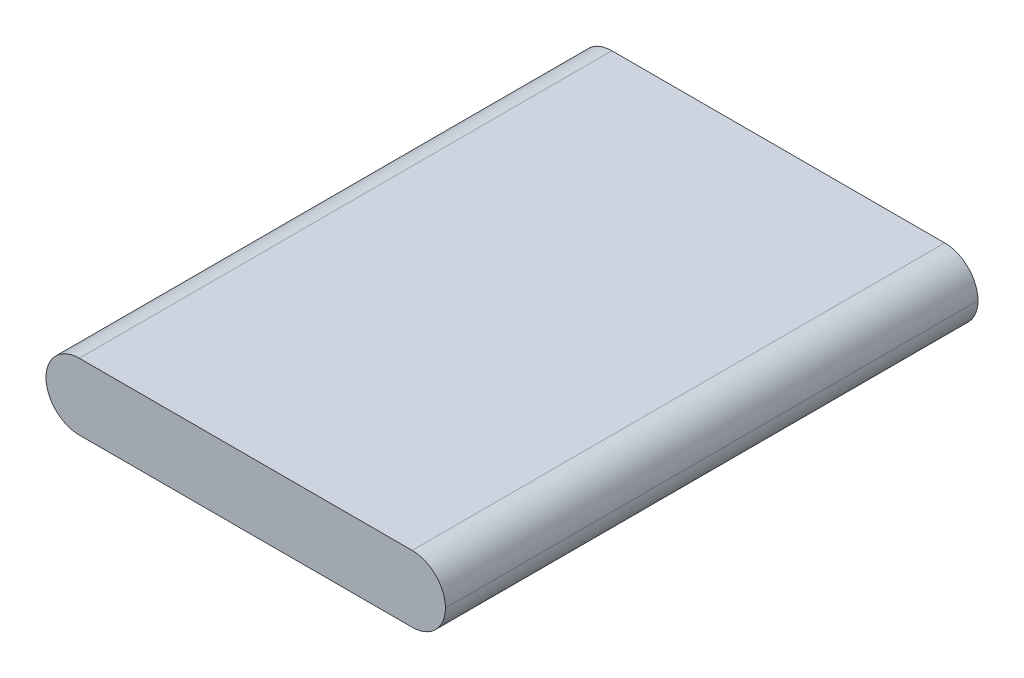
ISO-10303-21;
HEADER;
FILE_DESCRIPTION(('STEP AP214'),'2;1');
FILE_NAME('part.step','',(''),(''),'','','');
FILE_SCHEMA(('AUTOMOTIVE_DESIGN { 1 0 10303 214 1 1 1 1 }'));
ENDSEC;
DATA;
#1=APPLICATION_CONTEXT('core data for automotive mechanical design processes');
#2=APPLICATION_PROTOCOL_DEFINITION('international standard','automotive_design',2000,#1);
#3=PRODUCT_CONTEXT('',#1,'mechanical');
#4=PRODUCT('Part','Part','',(#3));
#5=PRODUCT_RELATED_PRODUCT_CATEGORY('part','',(#4));
#6=PRODUCT_DEFINITION_FORMATION('','',#4);
#7=PRODUCT_DEFINITION_CONTEXT('part definition',#1,'design');
#8=PRODUCT_DEFINITION('design','',#6,#7);
#9=PRODUCT_DEFINITION_SHAPE('','',#8);
#10=(LENGTH_UNIT() NAMED_UNIT(*) SI_UNIT(.MILLI.,.METRE.));
#11=(NAMED_UNIT(*) PLANE_ANGLE_UNIT() SI_UNIT($,.RADIAN.));
#12=(NAMED_UNIT(*) SI_UNIT($,.STERADIAN.) SOLID_ANGLE_UNIT());
#13=UNCERTAINTY_MEASURE_WITH_UNIT(LENGTH_MEASURE(1.E-05),#10,'distance_accuracy_value','');
#14=(GEOMETRIC_REPRESENTATION_CONTEXT(3) GLOBAL_UNCERTAINTY_ASSIGNED_CONTEXT((#13)) GLOBAL_UNIT_ASSIGNED_CONTEXT((#10,
#11,#12)) REPRESENTATION_CONTEXT('',''));
#15=CARTESIAN_POINT('',(0.,0.,0.));
#16=DIRECTION('',(0.,0.,1.));
#17=DIRECTION('',(1.,0.,0.));
#18=AXIS2_PLACEMENT_3D('',#15,#16,#17);
#19=CARTESIAN_POINT('',(-15.,2.5,-20.));
#20=DIRECTION('',(0.,0.,1.));
#21=DIRECTION('',(1.,0.,0.));
#22=AXIS2_PLACEMENT_3D('',#19,#20,#21);
#23=PLANE('',#22);
#24=CARTESIAN_POINT('',(12.5,0.,-20.));
#25=DIRECTION('',(0.,0.,1.));
#26=DIRECTION('',(1.,0.,0.));
#27=AXIS2_PLACEMENT_3D('',#24,#25,#26);
#28=CIRCLE('',#27,2.5);
#29=CARTESIAN_POINT('',(12.5,2.5,-20.));
#30=VERTEX_POINT('',#29);
#31=CARTESIAN_POINT('',(15.,0.,-20.));
#32=VERTEX_POINT('',#31);
#33=EDGE_CURVE('E99',#30,#32,#28,.F.);
#34=ORIENTED_EDGE('',*,*,#33,.T.);
#35=CARTESIAN_POINT('',(12.5,0.,-20.));
#36=DIRECTION('',(0.,0.,1.));
#37=DIRECTION('',(1.,0.,0.));
#38=AXIS2_PLACEMENT_3D('',#35,#36,#37);
#39=CIRCLE('',#38,2.5);
#40=CARTESIAN_POINT('',(12.5,-2.5,-20.));
#41=VERTEX_POINT('',#40);
#42=EDGE_CURVE('E94',#32,#41,#39,.F.);
#43=ORIENTED_EDGE('',*,*,#42,.T.);
#44=DIRECTION('',(-1.,0.,0.));
#45=VECTOR('',#44,1.);
#46=CARTESIAN_POINT('',(-15.,-2.5,-20.));
#47=LINE('',#46,#45);
#48=CARTESIAN_POINT('',(-12.5,-2.5,-20.));
#49=VERTEX_POINT('',#48);
#50=EDGE_CURVE('E96',#41,#49,#47,.T.);
#51=ORIENTED_EDGE('',*,*,#50,.T.);
#52=CARTESIAN_POINT('',(-12.5,0.,-20.));
#53=DIRECTION('',(0.,0.,1.));
#54=DIRECTION('',(1.,0.,0.));
#55=AXIS2_PLACEMENT_3D('',#52,#53,#54);
#56=CIRCLE('',#55,2.5);
#57=CARTESIAN_POINT('',(-15.,0.,-20.));
#58=VERTEX_POINT('',#57);
#59=EDGE_CURVE('E142',#49,#58,#56,.F.);
#60=ORIENTED_EDGE('',*,*,#59,.T.);
#61=CARTESIAN_POINT('',(-12.5,0.,-20.));
#62=DIRECTION('',(0.,0.,1.));
#63=DIRECTION('',(1.,0.,0.));
#64=AXIS2_PLACEMENT_3D('',#61,#62,#63);
#65=CIRCLE('',#64,2.5);
#66=CARTESIAN_POINT('',(-12.5,2.5,-20.));
#67=VERTEX_POINT('',#66);
#68=EDGE_CURVE('E146',#58,#67,#65,.F.);
#69=ORIENTED_EDGE('',*,*,#68,.T.);
#70=DIRECTION('',(-1.,0.,0.));
#71=VECTOR('',#70,1.);
#72=CARTESIAN_POINT('',(-15.,2.5,-20.));
#73=LINE('',#72,#71);
#74=EDGE_CURVE('E154',#30,#67,#73,.T.);
#75=ORIENTED_EDGE('',*,*,#74,.F.);
#76=EDGE_LOOP('',(#34,#43,#51,#60,#69,#75));
#77=FACE_BOUND('',#76,.T.);
#78=ADVANCED_FACE('F39',(#77),#23,.F.);
#79=CARTESIAN_POINT('',(-15.,2.5,20.));
#80=DIRECTION('',(0.,0.,-1.));
#81=DIRECTION('',(-1.,0.,0.));
#82=AXIS2_PLACEMENT_3D('',#79,#80,#81);
#83=PLANE('',#82);
#84=DIRECTION('',(1.,0.,0.));
#85=VECTOR('',#84,1.);
#86=CARTESIAN_POINT('',(-15.,-2.5,20.));
#87=LINE('',#86,#85);
#88=CARTESIAN_POINT('',(-12.5,-2.5,20.));
#89=VERTEX_POINT('',#88);
#90=CARTESIAN_POINT('',(12.5,-2.5,20.));
#91=VERTEX_POINT('',#90);
#92=EDGE_CURVE('E116',#89,#91,#87,.T.);
#93=ORIENTED_EDGE('',*,*,#92,.T.);
#94=CARTESIAN_POINT('',(12.5,0.,20.));
#95=DIRECTION('',(0.,0.,-1.));
#96=DIRECTION('',(-1.,0.,0.));
#97=AXIS2_PLACEMENT_3D('',#94,#95,#96);
#98=CIRCLE('',#97,2.5);
#99=CARTESIAN_POINT('',(15.,0.,20.));
#100=VERTEX_POINT('',#99);
#101=EDGE_CURVE('E120',#91,#100,#98,.F.);
#102=ORIENTED_EDGE('',*,*,#101,.T.);
#103=CARTESIAN_POINT('',(12.5,0.,20.));
#104=DIRECTION('',(0.,0.,-1.));
#105=DIRECTION('',(-1.,0.,0.));
#106=AXIS2_PLACEMENT_3D('',#103,#104,#105);
#107=CIRCLE('',#106,2.5);
#108=CARTESIAN_POINT('',(12.5,2.5,20.));
#109=VERTEX_POINT('',#108);
#110=EDGE_CURVE('E63',#100,#109,#107,.F.);
#111=ORIENTED_EDGE('',*,*,#110,.T.);
#112=DIRECTION('',(1.,0.,0.));
#113=VECTOR('',#112,1.);
#114=CARTESIAN_POINT('',(-15.,2.5,20.));
#115=LINE('',#114,#113);
#116=CARTESIAN_POINT('',(-12.5,2.5,20.));
#117=VERTEX_POINT('',#116);
#118=EDGE_CURVE('E149',#117,#109,#115,.T.);
#119=ORIENTED_EDGE('',*,*,#118,.F.);
#120=CARTESIAN_POINT('',(-12.5,0.,20.));
#121=DIRECTION('',(0.,0.,-1.));
#122=DIRECTION('',(-1.,0.,0.));
#123=AXIS2_PLACEMENT_3D('',#120,#121,#122);
#124=CIRCLE('',#123,2.5);
#125=CARTESIAN_POINT('',(-15.,0.,20.));
#126=VERTEX_POINT('',#125);
#127=EDGE_CURVE('E57',#117,#126,#124,.F.);
#128=ORIENTED_EDGE('',*,*,#127,.T.);
#129=CARTESIAN_POINT('',(-12.5,0.,20.));
#130=DIRECTION('',(0.,0.,-1.));
#131=DIRECTION('',(-1.,0.,0.));
#132=AXIS2_PLACEMENT_3D('',#129,#130,#131);
#133=CIRCLE('',#132,2.5);
#134=EDGE_CURVE('E125',#126,#89,#133,.F.);
#135=ORIENTED_EDGE('',*,*,#134,.T.);
#136=EDGE_LOOP('',(#93,#102,#111,#119,#128,#135));
#137=FACE_BOUND('',#136,.T.);
#138=ADVANCED_FACE('F176',(#137),#83,.F.);
#139=CARTESIAN_POINT('',(0.,2.5,0.));
#140=DIRECTION('',(0.,-1.,0.));
#141=DIRECTION('',(0.,0.,-1.));
#142=AXIS2_PLACEMENT_3D('',#139,#140,#141);
#143=PLANE('',#142);
#144=ORIENTED_EDGE('',*,*,#118,.T.);
#145=DIRECTION('',(0.,0.,-1.));
#146=VECTOR('',#145,1.);
#147=CARTESIAN_POINT('',(12.5,2.5,0.));
#148=LINE('',#147,#146);
#149=EDGE_CURVE('E11',#109,#30,#148,.T.);
#150=ORIENTED_EDGE('',*,*,#149,.T.);
#151=ORIENTED_EDGE('',*,*,#74,.T.);
#152=DIRECTION('',(0.,0.,1.));
#153=VECTOR('',#152,1.);
#154=CARTESIAN_POINT('',(-12.5,2.5,0.));
#155=LINE('',#154,#153);
#156=EDGE_CURVE('E49',#67,#117,#155,.T.);
#157=ORIENTED_EDGE('',*,*,#156,.T.);
#158=EDGE_LOOP('',(#144,#150,#151,#157));
#159=FACE_BOUND('',#158,.T.);
#160=ADVANCED_FACE('F163',(#159),#143,.F.);
#161=CARTESIAN_POINT('',(0.,-2.5,0.));
#162=DIRECTION('',(0.,-1.,0.));
#163=DIRECTION('',(0.,0.,-1.));
#164=AXIS2_PLACEMENT_3D('',#161,#162,#163);
#165=PLANE('',#164);
#166=ORIENTED_EDGE('',*,*,#50,.F.);
#167=DIRECTION('',(0.,0.,-1.));
#168=VECTOR('',#167,1.);
#169=CARTESIAN_POINT('',(12.5,-2.5,20.));
#170=LINE('',#169,#168);
#171=EDGE_CURVE('E112',#41,#91,#170,.F.);
#172=ORIENTED_EDGE('',*,*,#171,.T.);
#173=ORIENTED_EDGE('',*,*,#92,.F.);
#174=DIRECTION('',(0.,0.,1.));
#175=VECTOR('',#174,1.);
#176=CARTESIAN_POINT('',(-12.5,-2.5,-20.));
#177=LINE('',#176,#175);
#178=EDGE_CURVE('E105',#89,#49,#177,.F.);
#179=ORIENTED_EDGE('',*,*,#178,.T.);
#180=EDGE_LOOP('',(#166,#172,#173,#179));
#181=FACE_BOUND('',#180,.T.);
#182=ADVANCED_FACE('F110',(#181),#165,.T.);
#183=CARTESIAN_POINT('',(12.5,0.,0.));
#184=DIRECTION('',(0.,0.,-1.));
#185=DIRECTION('',(-1.,0.,0.));
#186=AXIS2_PLACEMENT_3D('',#183,#184,#185);
#187=CYLINDRICAL_SURFACE('',#186,2.5);
#188=ORIENTED_EDGE('',*,*,#149,.F.);
#189=ORIENTED_EDGE('',*,*,#110,.F.);
#190=DIRECTION('',(0.,0.,-1.));
#191=VECTOR('',#190,1.);
#192=CARTESIAN_POINT('',(15.,0.,20.));
#193=LINE('',#192,#191);
#194=EDGE_CURVE('E117',#32,#100,#193,.F.);
#195=ORIENTED_EDGE('',*,*,#194,.F.);
#196=ORIENTED_EDGE('',*,*,#33,.F.);
#197=EDGE_LOOP('',(#188,#189,#195,#196));
#198=FACE_BOUND('',#197,.T.);
#199=ADVANCED_FACE('F166',(#198),#187,.T.);
#200=CARTESIAN_POINT('',(12.5,0.,20.));
#201=DIRECTION('',(0.,0.,1.));
#202=DIRECTION('',(1.,0.,0.));
#203=AXIS2_PLACEMENT_3D('',#200,#201,#202);
#204=CYLINDRICAL_SURFACE('',#203,2.5);
#205=ORIENTED_EDGE('',*,*,#101,.F.);
#206=ORIENTED_EDGE('',*,*,#171,.F.);
#207=ORIENTED_EDGE('',*,*,#42,.F.);
#208=ORIENTED_EDGE('',*,*,#194,.T.);
#209=EDGE_LOOP('',(#205,#206,#207,#208));
#210=FACE_BOUND('',#209,.T.);
#211=ADVANCED_FACE('F119',(#210),#204,.T.);
#212=CARTESIAN_POINT('',(-12.5,0.,0.));
#213=DIRECTION('',(0.,0.,1.));
#214=DIRECTION('',(1.,0.,0.));
#215=AXIS2_PLACEMENT_3D('',#212,#213,#214);
#216=CYLINDRICAL_SURFACE('',#215,2.5);
#217=ORIENTED_EDGE('',*,*,#156,.F.);
#218=ORIENTED_EDGE('',*,*,#68,.F.);
#219=DIRECTION('',(0.,0.,1.));
#220=VECTOR('',#219,1.);
#221=CARTESIAN_POINT('',(-15.,0.,20.));
#222=LINE('',#221,#220);
#223=EDGE_CURVE('E43',#126,#58,#222,.F.);
#224=ORIENTED_EDGE('',*,*,#223,.F.);
#225=ORIENTED_EDGE('',*,*,#127,.F.);
#226=EDGE_LOOP('',(#217,#218,#224,#225));
#227=FACE_BOUND('',#226,.T.);
#228=ADVANCED_FACE('F41',(#227),#216,.T.);
#229=CARTESIAN_POINT('',(-12.5,0.,20.));
#230=DIRECTION('',(0.,0.,-1.));
#231=DIRECTION('',(-1.,0.,0.));
#232=AXIS2_PLACEMENT_3D('',#229,#230,#231);
#233=CYLINDRICAL_SURFACE('',#232,2.5);
#234=ORIENTED_EDGE('',*,*,#59,.F.);
#235=ORIENTED_EDGE('',*,*,#178,.F.);
#236=ORIENTED_EDGE('',*,*,#134,.F.);
#237=ORIENTED_EDGE('',*,*,#223,.T.);
#238=EDGE_LOOP('',(#234,#235,#236,#237));
#239=FACE_BOUND('',#238,.T.);
#240=ADVANCED_FACE('F141',(#239),#233,.T.);
#241=CLOSED_SHELL('',(#78,#138,#160,#182,#199,#211,#228,#240));
#242=MANIFOLD_SOLID_BREP('B2',#241);
#243=ADVANCED_BREP_SHAPE_REPRESENTATION('',(#18,#242),#14);
#244=SHAPE_DEFINITION_REPRESENTATION(#9,#243);
ENDSEC;
END-ISO-10303-21;
